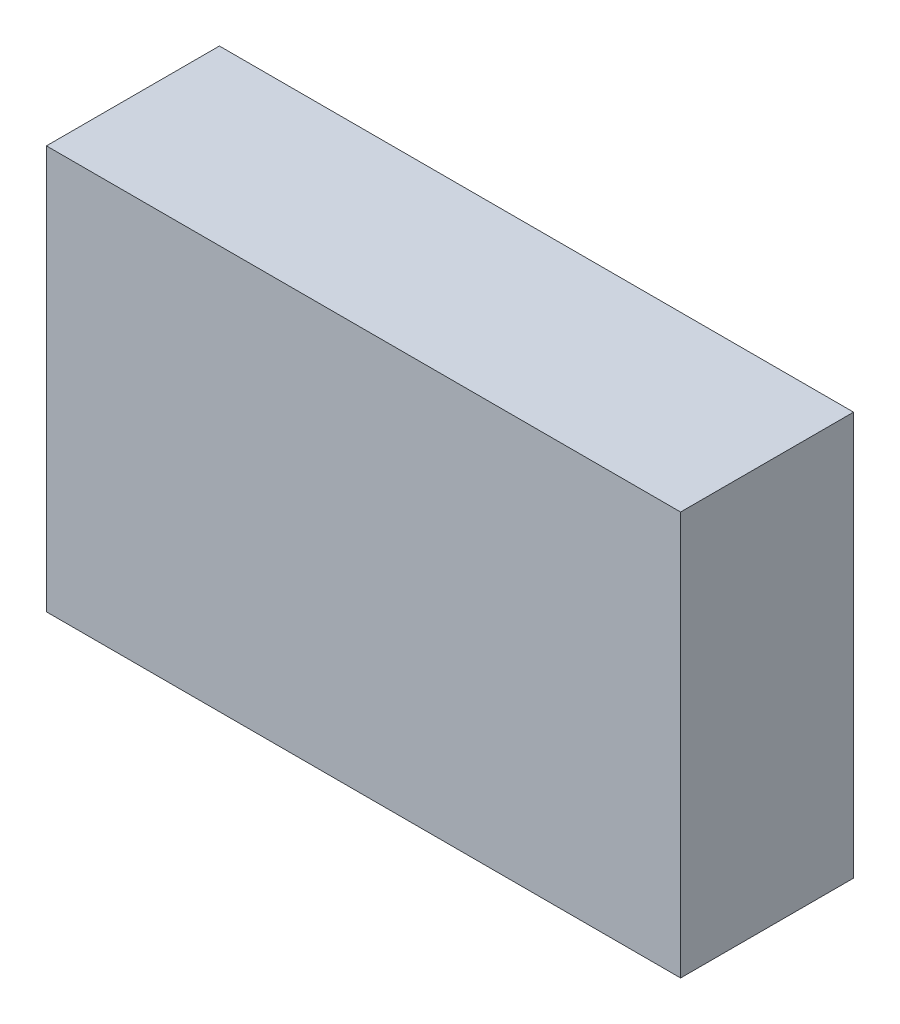
ISO-10303-21;
HEADER;
FILE_DESCRIPTION(('STEP AP214'),'2;1');
FILE_NAME('part.step','',(''),(''),'','','');
FILE_SCHEMA(('AUTOMOTIVE_DESIGN { 1 0 10303 214 1 1 1 1 }'));
ENDSEC;
DATA;
#1=APPLICATION_CONTEXT('core data for automotive mechanical design processes');
#2=APPLICATION_PROTOCOL_DEFINITION('international standard','automotive_design',2000,#1);
#3=PRODUCT_CONTEXT('',#1,'mechanical');
#4=PRODUCT('Part','Part','',(#3));
#5=PRODUCT_RELATED_PRODUCT_CATEGORY('part','',(#4));
#6=PRODUCT_DEFINITION_FORMATION('','',#4);
#7=PRODUCT_DEFINITION_CONTEXT('part definition',#1,'design');
#8=PRODUCT_DEFINITION('design','',#6,#7);
#9=PRODUCT_DEFINITION_SHAPE('','',#8);
#10=(LENGTH_UNIT() NAMED_UNIT(*) SI_UNIT(.MILLI.,.METRE.));
#11=(NAMED_UNIT(*) PLANE_ANGLE_UNIT() SI_UNIT($,.RADIAN.));
#12=(NAMED_UNIT(*) SI_UNIT($,.STERADIAN.) SOLID_ANGLE_UNIT());
#13=UNCERTAINTY_MEASURE_WITH_UNIT(LENGTH_MEASURE(1.E-05),#10,'distance_accuracy_value','');
#14=(GEOMETRIC_REPRESENTATION_CONTEXT(3) GLOBAL_UNCERTAINTY_ASSIGNED_CONTEXT((#13)) GLOBAL_UNIT_ASSIGNED_CONTEXT((#10,
#11,#12)) REPRESENTATION_CONTEXT('',''));
#15=CARTESIAN_POINT('',(0.,0.,0.));
#16=DIRECTION('',(0.,0.,1.));
#17=DIRECTION('',(1.,0.,0.));
#18=AXIS2_PLACEMENT_3D('',#15,#16,#17);
#19=CARTESIAN_POINT('',(-0.55,0.35,0.));
#20=DIRECTION('',(-1.,0.,0.));
#21=DIRECTION('',(0.,0.,1.));
#22=AXIS2_PLACEMENT_3D('',#19,#20,#21);
#23=PLANE('',#22);
#24=DIRECTION('',(0.,1.,0.));
#25=VECTOR('',#24,1.);
#26=CARTESIAN_POINT('',(-0.55,-0.35,0.));
#27=LINE('',#26,#25);
#28=CARTESIAN_POINT('',(-0.55,-0.35,0.));
#29=VERTEX_POINT('',#28);
#30=CARTESIAN_POINT('',(-0.55,0.35,0.));
#31=VERTEX_POINT('',#30);
#32=EDGE_CURVE('E77',#29,#31,#27,.T.);
#33=ORIENTED_EDGE('',*,*,#32,.F.);
#34=DIRECTION('',(0.,0.,1.));
#35=VECTOR('',#34,1.);
#36=CARTESIAN_POINT('',(-0.55,-0.35,0.));
#37=LINE('',#36,#35);
#38=CARTESIAN_POINT('',(-0.55,-0.35,0.3));
#39=VERTEX_POINT('',#38);
#40=EDGE_CURVE('E72',#29,#39,#37,.T.);
#41=ORIENTED_EDGE('',*,*,#40,.T.);
#42=DIRECTION('',(0.,-1.,0.));
#43=VECTOR('',#42,1.);
#44=CARTESIAN_POINT('',(-0.55,-0.35,0.3));
#45=LINE('',#44,#43);
#46=CARTESIAN_POINT('',(-0.55,0.35,0.3));
#47=VERTEX_POINT('',#46);
#48=EDGE_CURVE('E74',#47,#39,#45,.T.);
#49=ORIENTED_EDGE('',*,*,#48,.F.);
#50=DIRECTION('',(0.,0.,1.));
#51=VECTOR('',#50,1.);
#52=CARTESIAN_POINT('',(-0.55,0.35,0.));
#53=LINE('',#52,#51);
#54=EDGE_CURVE('E11',#31,#47,#53,.T.);
#55=ORIENTED_EDGE('',*,*,#54,.F.);
#56=EDGE_LOOP('',(#33,#41,#49,#55));
#57=FACE_BOUND('',#56,.T.);
#58=ADVANCED_FACE('F17',(#57),#23,.T.);
#59=CARTESIAN_POINT('',(0.55,0.35,0.));
#60=DIRECTION('',(0.,1.,0.));
#61=DIRECTION('',(1.,0.,0.));
#62=AXIS2_PLACEMENT_3D('',#59,#60,#61);
#63=PLANE('',#62);
#64=DIRECTION('',(1.,0.,0.));
#65=VECTOR('',#64,1.);
#66=CARTESIAN_POINT('',(-0.55,0.35,0.));
#67=LINE('',#66,#65);
#68=CARTESIAN_POINT('',(0.55,0.35,0.));
#69=VERTEX_POINT('',#68);
#70=EDGE_CURVE('E103',#31,#69,#67,.T.);
#71=ORIENTED_EDGE('',*,*,#70,.F.);
#72=ORIENTED_EDGE('',*,*,#54,.T.);
#73=DIRECTION('',(-1.,0.,0.));
#74=VECTOR('',#73,1.);
#75=CARTESIAN_POINT('',(-0.55,0.35,0.3));
#76=LINE('',#75,#74);
#77=CARTESIAN_POINT('',(0.55,0.35,0.3));
#78=VERTEX_POINT('',#77);
#79=EDGE_CURVE('E90',#78,#47,#76,.T.);
#80=ORIENTED_EDGE('',*,*,#79,.F.);
#81=DIRECTION('',(0.,0.,1.));
#82=VECTOR('',#81,1.);
#83=CARTESIAN_POINT('',(0.55,0.35,0.));
#84=LINE('',#83,#82);
#85=EDGE_CURVE('E27',#69,#78,#84,.T.);
#86=ORIENTED_EDGE('',*,*,#85,.F.);
#87=EDGE_LOOP('',(#71,#72,#80,#86));
#88=FACE_BOUND('',#87,.T.);
#89=ADVANCED_FACE('F120',(#88),#63,.T.);
#90=CARTESIAN_POINT('',(0.55,-0.35,0.));
#91=DIRECTION('',(1.,0.,0.));
#92=DIRECTION('',(0.,1.,0.));
#93=AXIS2_PLACEMENT_3D('',#90,#91,#92);
#94=PLANE('',#93);
#95=DIRECTION('',(0.,-1.,0.));
#96=VECTOR('',#95,1.);
#97=CARTESIAN_POINT('',(0.55,0.35,0.));
#98=LINE('',#97,#96);
#99=CARTESIAN_POINT('',(0.55,-0.35,0.));
#100=VERTEX_POINT('',#99);
#101=EDGE_CURVE('E21',#69,#100,#98,.T.);
#102=ORIENTED_EDGE('',*,*,#101,.F.);
#103=ORIENTED_EDGE('',*,*,#85,.T.);
#104=DIRECTION('',(0.,1.,0.));
#105=VECTOR('',#104,1.);
#106=CARTESIAN_POINT('',(0.55,0.35,0.3));
#107=LINE('',#106,#105);
#108=CARTESIAN_POINT('',(0.55,-0.35,0.3));
#109=VERTEX_POINT('',#108);
#110=EDGE_CURVE('E94',#109,#78,#107,.T.);
#111=ORIENTED_EDGE('',*,*,#110,.F.);
#112=DIRECTION('',(0.,0.,1.));
#113=VECTOR('',#112,1.);
#114=CARTESIAN_POINT('',(0.55,-0.35,0.));
#115=LINE('',#114,#113);
#116=EDGE_CURVE('E83',#100,#109,#115,.T.);
#117=ORIENTED_EDGE('',*,*,#116,.F.);
#118=EDGE_LOOP('',(#102,#103,#111,#117));
#119=FACE_BOUND('',#118,.T.);
#120=ADVANCED_FACE('F121',(#119),#94,.T.);
#121=CARTESIAN_POINT('',(-0.55,-0.35,0.));
#122=DIRECTION('',(0.,-1.,0.));
#123=DIRECTION('',(0.,0.,-1.));
#124=AXIS2_PLACEMENT_3D('',#121,#122,#123);
#125=PLANE('',#124);
#126=DIRECTION('',(-1.,0.,0.));
#127=VECTOR('',#126,1.);
#128=CARTESIAN_POINT('',(0.55,-0.35,0.));
#129=LINE('',#128,#127);
#130=EDGE_CURVE('E108',#100,#29,#129,.T.);
#131=ORIENTED_EDGE('',*,*,#130,.F.);
#132=ORIENTED_EDGE('',*,*,#116,.T.);
#133=DIRECTION('',(1.,0.,0.));
#134=VECTOR('',#133,1.);
#135=CARTESIAN_POINT('',(0.55,-0.35,0.3));
#136=LINE('',#135,#134);
#137=EDGE_CURVE('E89',#39,#109,#136,.T.);
#138=ORIENTED_EDGE('',*,*,#137,.F.);
#139=ORIENTED_EDGE('',*,*,#40,.F.);
#140=EDGE_LOOP('',(#131,#132,#138,#139));
#141=FACE_BOUND('',#140,.T.);
#142=ADVANCED_FACE('F19',(#141),#125,.T.);
#143=CARTESIAN_POINT('',(0.,0.,0.3));
#144=DIRECTION('',(0.,0.,1.));
#145=DIRECTION('',(1.,0.,0.));
#146=AXIS2_PLACEMENT_3D('',#143,#144,#145);
#147=PLANE('',#146);
#148=ORIENTED_EDGE('',*,*,#137,.T.);
#149=ORIENTED_EDGE('',*,*,#110,.T.);
#150=ORIENTED_EDGE('',*,*,#79,.T.);
#151=ORIENTED_EDGE('',*,*,#48,.T.);
#152=EDGE_LOOP('',(#148,#149,#150,#151));
#153=FACE_BOUND('',#152,.T.);
#154=ADVANCED_FACE('F87',(#153),#147,.T.);
#155=CARTESIAN_POINT('',(0.,0.,0.));
#156=DIRECTION('',(0.,0.,1.));
#157=DIRECTION('',(1.,0.,0.));
#158=AXIS2_PLACEMENT_3D('',#155,#156,#157);
#159=PLANE('',#158);
#160=ORIENTED_EDGE('',*,*,#130,.T.);
#161=ORIENTED_EDGE('',*,*,#32,.T.);
#162=ORIENTED_EDGE('',*,*,#70,.T.);
#163=ORIENTED_EDGE('',*,*,#101,.T.);
#164=EDGE_LOOP('',(#160,#161,#162,#163));
#165=FACE_BOUND('',#164,.T.);
#166=ADVANCED_FACE('F119',(#165),#159,.F.);
#167=CLOSED_SHELL('',(#58,#89,#120,#142,#154,#166));
#168=MANIFOLD_SOLID_BREP('B1',#167);
#169=ADVANCED_BREP_SHAPE_REPRESENTATION('',(#18,#168),#14);
#170=SHAPE_DEFINITION_REPRESENTATION(#9,#169);
ENDSEC;
END-ISO-10303-21;
